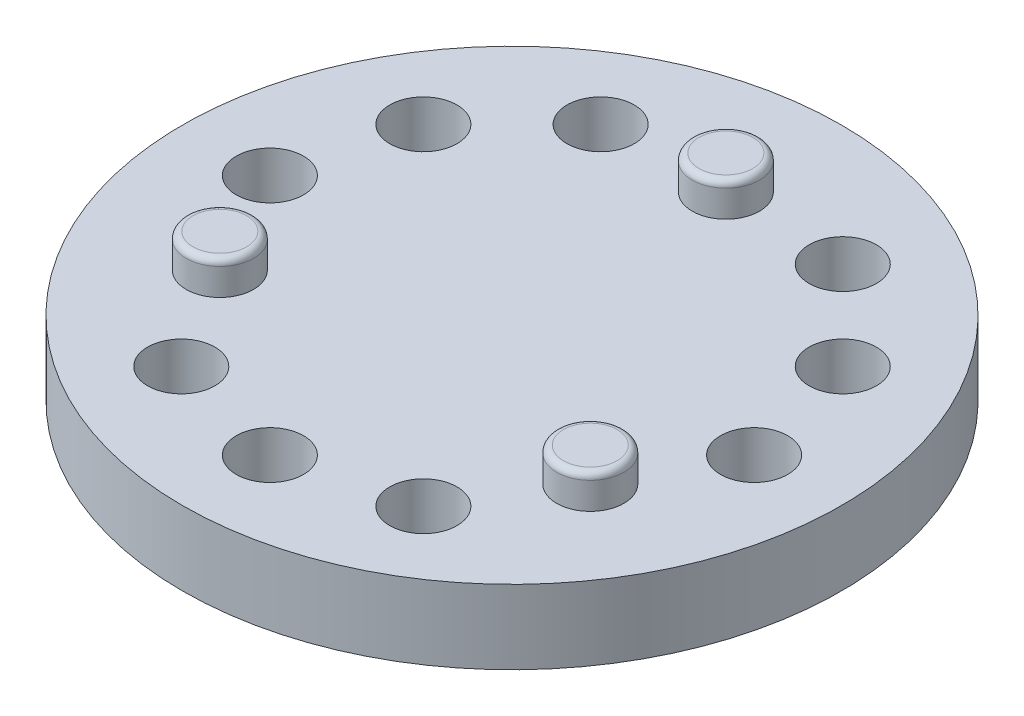
ISO-10303-21;
HEADER;
FILE_DESCRIPTION(('STEP AP214'),'2;1');
FILE_NAME('part.step','',(''),(''),'','','');
FILE_SCHEMA(('AUTOMOTIVE_DESIGN { 1 0 10303 214 1 1 1 1 }'));
ENDSEC;
DATA;
#1=APPLICATION_CONTEXT('core data for automotive mechanical design processes');
#2=APPLICATION_PROTOCOL_DEFINITION('international standard','automotive_design',2000,#1);
#3=PRODUCT_CONTEXT('',#1,'mechanical');
#4=PRODUCT('Part','Part','',(#3));
#5=PRODUCT_RELATED_PRODUCT_CATEGORY('part','',(#4));
#6=PRODUCT_DEFINITION_FORMATION('','',#4);
#7=PRODUCT_DEFINITION_CONTEXT('part definition',#1,'design');
#8=PRODUCT_DEFINITION('design','',#6,#7);
#9=PRODUCT_DEFINITION_SHAPE('','',#8);
#10=(LENGTH_UNIT() NAMED_UNIT(*) SI_UNIT(.MILLI.,.METRE.));
#11=(NAMED_UNIT(*) PLANE_ANGLE_UNIT() SI_UNIT($,.RADIAN.));
#12=(NAMED_UNIT(*) SI_UNIT($,.STERADIAN.) SOLID_ANGLE_UNIT());
#13=UNCERTAINTY_MEASURE_WITH_UNIT(LENGTH_MEASURE(1.E-05),#10,'distance_accuracy_value','');
#14=(GEOMETRIC_REPRESENTATION_CONTEXT(3) GLOBAL_UNCERTAINTY_ASSIGNED_CONTEXT((#13)) GLOBAL_UNIT_ASSIGNED_CONTEXT((#10,
#11,#12)) REPRESENTATION_CONTEXT('',''));
#15=CARTESIAN_POINT('',(0.,0.,0.));
#16=DIRECTION('',(0.,0.,1.));
#17=DIRECTION('',(1.,0.,0.));
#18=AXIS2_PLACEMENT_3D('',#15,#16,#17);
#19=CARTESIAN_POINT('',(0.,5.5,0.));
#20=DIRECTION('',(0.,-1.,0.));
#21=DIRECTION('',(0.,0.,-1.));
#22=AXIS2_PLACEMENT_3D('',#19,#20,#21);
#23=CYLINDRICAL_SURFACE('',#22,24.5);
#24=CARTESIAN_POINT('',(0.,5.5,0.));
#25=DIRECTION('',(0.,1.,0.));
#26=DIRECTION('',(0.,0.,1.));
#27=AXIS2_PLACEMENT_3D('',#24,#25,#26);
#28=CIRCLE('',#27,24.5);
#29=CARTESIAN_POINT('',(0.,5.5,24.5));
#30=VERTEX_POINT('',#29);
#31=EDGE_CURVE('E73',#30,#30,#28,.T.);
#32=ORIENTED_EDGE('',*,*,#31,.F.);
#33=EDGE_LOOP('',(#32));
#34=FACE_BOUND('',#33,.T.);
#35=CARTESIAN_POINT('',(0.,0.,0.));
#36=DIRECTION('',(0.,1.,0.));
#37=DIRECTION('',(0.,0.,1.));
#38=AXIS2_PLACEMENT_3D('',#35,#36,#37);
#39=CIRCLE('',#38,24.5);
#40=CARTESIAN_POINT('',(0.,0.,24.5));
#41=VERTEX_POINT('',#40);
#42=EDGE_CURVE('E78',#41,#41,#39,.T.);
#43=ORIENTED_EDGE('',*,*,#42,.T.);
#44=EDGE_LOOP('',(#43));
#45=FACE_BOUND('',#44,.T.);
#46=ADVANCED_FACE('F41',(#34,#45),#23,.T.);
#47=CARTESIAN_POINT('',(0.,5.5,0.));
#48=DIRECTION('',(0.,1.,0.));
#49=DIRECTION('',(0.,0.,1.));
#50=AXIS2_PLACEMENT_3D('',#47,#48,#49);
#51=PLANE('',#50);
#52=CARTESIAN_POINT('',(-13.7698039201709,5.5,7.94999999999895));
#53=DIRECTION('',(0.,1.,0.));
#54=DIRECTION('',(0.,0.,1.));
#55=AXIS2_PLACEMENT_3D('',#52,#53,#54);
#56=CIRCLE('',#55,2.50000000000063);
#57=CARTESIAN_POINT('',(-13.7698039201709,5.5,10.4499999999996));
#58=VERTEX_POINT('',#57);
#59=EDGE_CURVE('E161',#58,#58,#56,.T.);
#60=ORIENTED_EDGE('',*,*,#59,.F.);
#61=EDGE_LOOP('',(#60));
#62=FACE_BOUND('',#61,.T.);
#63=CARTESIAN_POINT('',(13.7698039201725,5.5,7.95000000000007));
#64=DIRECTION('',(0.,1.,0.));
#65=DIRECTION('',(0.,0.,1.));
#66=AXIS2_PLACEMENT_3D('',#63,#64,#65);
#67=CIRCLE('',#66,2.5);
#68=CARTESIAN_POINT('',(13.7698039201725,5.5,10.4500000000001));
#69=VERTEX_POINT('',#68);
#70=EDGE_CURVE('E157',#69,#69,#67,.T.);
#71=ORIENTED_EDGE('',*,*,#70,.F.);
#72=EDGE_LOOP('',(#71));
#73=FACE_BOUND('',#72,.T.);
#74=CARTESIAN_POINT('',(1.78074320378268E-12,5.5,-15.899999999999));
#75=DIRECTION('',(0.,1.,0.));
#76=DIRECTION('',(0.,0.,1.));
#77=AXIS2_PLACEMENT_3D('',#74,#75,#76);
#78=CIRCLE('',#77,2.49999999999858);
#79=CARTESIAN_POINT('',(1.78074320378268E-12,5.5,-13.4000000000004));
#80=VERTEX_POINT('',#79);
#81=EDGE_CURVE('E143',#80,#80,#78,.T.);
#82=ORIENTED_EDGE('',*,*,#81,.F.);
#83=EDGE_LOOP('',(#82));
#84=FACE_BOUND('',#83,.T.);
#85=CARTESIAN_POINT('',(-15.5884572681201,5.5,-8.99999999999809));
#86=DIRECTION('',(0.,1.,0.));
#87=DIRECTION('',(0.,0.,1.));
#88=AXIS2_PLACEMENT_3D('',#85,#86,#87);
#89=CIRCLE('',#88,2.50000000000189);
#90=CARTESIAN_POINT('',(-15.5884572681201,5.5,-6.4999999999962));
#91=VERTEX_POINT('',#90);
#92=EDGE_CURVE('E121',#91,#91,#89,.T.);
#93=ORIENTED_EDGE('',*,*,#92,.F.);
#94=EDGE_LOOP('',(#93));
#95=FACE_BOUND('',#94,.T.);
#96=CARTESIAN_POINT('',(-17.9999999999983,5.5,3.07118516144527E-12));
#97=DIRECTION('',(0.,1.,0.));
#98=DIRECTION('',(0.,0.,1.));
#99=AXIS2_PLACEMENT_3D('',#96,#97,#98);
#100=CIRCLE('',#99,2.50000000000349);
#101=CARTESIAN_POINT('',(-17.9999999999983,5.5,2.50000000000656));
#102=VERTEX_POINT('',#101);
#103=EDGE_CURVE('E131',#102,#102,#100,.T.);
#104=ORIENTED_EDGE('',*,*,#103,.F.);
#105=EDGE_LOOP('',(#104));
#106=FACE_BOUND('',#105,.T.);
#107=CARTESIAN_POINT('',(3.50527959155829E-12,5.5,18.0000000000023));
#108=DIRECTION('',(0.,1.,0.));
#109=DIRECTION('',(0.,0.,1.));
#110=AXIS2_PLACEMENT_3D('',#107,#108,#109);
#111=CIRCLE('',#110,2.50000000000076);
#112=CARTESIAN_POINT('',(3.50527959155829E-12,5.5,20.5000000000031));
#113=VERTEX_POINT('',#112);
#114=EDGE_CURVE('E126',#113,#113,#111,.T.);
#115=ORIENTED_EDGE('',*,*,#114,.F.);
#116=EDGE_LOOP('',(#115));
#117=FACE_BOUND('',#116,.T.);
#118=CARTESIAN_POINT('',(9.00000000000352,5.5,15.5884572681199));
#119=DIRECTION('',(0.,1.,0.));
#120=DIRECTION('',(0.,0.,1.));
#121=AXIS2_PLACEMENT_3D('',#118,#119,#120);
#122=CIRCLE('',#121,2.50000000000082);
#123=CARTESIAN_POINT('',(9.00000000000352,5.5,18.0884572681208));
#124=VERTEX_POINT('',#123);
#125=EDGE_CURVE('E122',#124,#124,#122,.T.);
#126=ORIENTED_EDGE('',*,*,#125,.F.);
#127=EDGE_LOOP('',(#126));
#128=FACE_BOUND('',#127,.T.);
#129=CARTESIAN_POINT('',(-9.00000000000117,5.5,-15.5884572681198));
#130=DIRECTION('',(0.,1.,0.));
#131=DIRECTION('',(0.,0.,1.));
#132=AXIS2_PLACEMENT_3D('',#129,#130,#131);
#133=CIRCLE('',#132,2.50000000000055);
#134=CARTESIAN_POINT('',(-9.00000000000117,5.5,-13.0884572681192));
#135=VERTEX_POINT('',#134);
#136=EDGE_CURVE('E127',#135,#135,#133,.T.);
#137=ORIENTED_EDGE('',*,*,#136,.F.);
#138=EDGE_LOOP('',(#137));
#139=FACE_BOUND('',#138,.T.);
#140=CARTESIAN_POINT('',(9.00000000000001,5.5,-15.5884572681199));
#141=DIRECTION('',(0.,1.,0.));
#142=DIRECTION('',(0.,0.,1.));
#143=AXIS2_PLACEMENT_3D('',#140,#141,#142);
#144=CIRCLE('',#143,2.5);
#145=CARTESIAN_POINT('',(9.00000000000001,5.5,-13.0884572681199));
#146=VERTEX_POINT('',#145);
#147=EDGE_CURVE('E147',#146,#146,#144,.T.);
#148=ORIENTED_EDGE('',*,*,#147,.F.);
#149=EDGE_LOOP('',(#148));
#150=FACE_BOUND('',#149,.T.);
#151=CARTESIAN_POINT('',(15.5884572681219,5.5,-9.00000000000112));
#152=DIRECTION('',(0.,1.,0.));
#153=DIRECTION('',(0.,0.,1.));
#154=AXIS2_PLACEMENT_3D('',#151,#152,#153);
#155=CIRCLE('',#154,2.49999999999832);
#156=CARTESIAN_POINT('',(15.5884572681219,5.5,-6.5000000000028));
#157=VERTEX_POINT('',#156);
#158=EDGE_CURVE('E142',#157,#157,#155,.T.);
#159=ORIENTED_EDGE('',*,*,#158,.F.);
#160=EDGE_LOOP('',(#159));
#161=FACE_BOUND('',#160,.T.);
#162=CARTESIAN_POINT('',(18.000000000004,5.5,-1.01915355016992E-12));
#163=DIRECTION('',(0.,1.,0.));
#164=DIRECTION('',(0.,0.,1.));
#165=AXIS2_PLACEMENT_3D('',#162,#163,#164);
#166=CIRCLE('',#165,2.49999999999782);
#167=CARTESIAN_POINT('',(18.000000000004,5.5,2.4999999999968));
#168=VERTEX_POINT('',#167);
#169=EDGE_CURVE('E138',#168,#168,#166,.T.);
#170=ORIENTED_EDGE('',*,*,#169,.F.);
#171=EDGE_LOOP('',(#170));
#172=FACE_BOUND('',#171,.T.);
#173=CARTESIAN_POINT('',(-8.99999999999758,5.5,15.5884572681239));
#174=DIRECTION('',(0.,1.,0.));
#175=DIRECTION('',(0.,0.,1.));
#176=AXIS2_PLACEMENT_3D('',#173,#174,#175);
#177=CIRCLE('',#176,2.50000000000125);
#178=CARTESIAN_POINT('',(-8.99999999999758,5.5,18.0884572681252));
#179=VERTEX_POINT('',#178);
#180=EDGE_CURVE('E111',#179,#179,#177,.T.);
#181=ORIENTED_EDGE('',*,*,#180,.F.);
#182=EDGE_LOOP('',(#181));
#183=FACE_BOUND('',#182,.T.);
#184=ORIENTED_EDGE('',*,*,#31,.T.);
#185=EDGE_LOOP('',(#184));
#186=FACE_BOUND('',#185,.T.);
#187=ADVANCED_FACE('F168',(#62,#73,#84,#95,#106,#117,#128,#139,#150,#161,#172,#183,#186),#51,.T.);
#188=CARTESIAN_POINT('',(0.,0.,0.));
#189=DIRECTION('',(0.,1.,0.));
#190=DIRECTION('',(0.,0.,1.));
#191=AXIS2_PLACEMENT_3D('',#188,#189,#190);
#192=PLANE('',#191);
#193=CARTESIAN_POINT('',(-15.5884572681201,0.,-8.99999999999809));
#194=DIRECTION('',(0.,1.,0.));
#195=DIRECTION('',(0.,0.,1.));
#196=AXIS2_PLACEMENT_3D('',#193,#194,#195);
#197=CIRCLE('',#196,2.50000000000189);
#198=CARTESIAN_POINT('',(-15.5884572681201,0.,-6.4999999999962));
#199=VERTEX_POINT('',#198);
#200=EDGE_CURVE('E74',#199,#199,#197,.T.);
#201=ORIENTED_EDGE('',*,*,#200,.T.);
#202=EDGE_LOOP('',(#201));
#203=FACE_BOUND('',#202,.T.);
#204=CARTESIAN_POINT('',(-17.9999999999983,0.,3.07118516144527E-12));
#205=DIRECTION('',(0.,1.,0.));
#206=DIRECTION('',(0.,0.,1.));
#207=AXIS2_PLACEMENT_3D('',#204,#205,#206);
#208=CIRCLE('',#207,2.50000000000349);
#209=CARTESIAN_POINT('',(-17.9999999999983,0.,2.50000000000656));
#210=VERTEX_POINT('',#209);
#211=EDGE_CURVE('E79',#210,#210,#208,.T.);
#212=ORIENTED_EDGE('',*,*,#211,.T.);
#213=EDGE_LOOP('',(#212));
#214=FACE_BOUND('',#213,.T.);
#215=CARTESIAN_POINT('',(3.50527959155829E-12,0.,18.0000000000023));
#216=DIRECTION('',(0.,1.,0.));
#217=DIRECTION('',(0.,0.,1.));
#218=AXIS2_PLACEMENT_3D('',#215,#216,#217);
#219=CIRCLE('',#218,2.50000000000076);
#220=CARTESIAN_POINT('',(3.50527959155829E-12,0.,20.5000000000031));
#221=VERTEX_POINT('',#220);
#222=EDGE_CURVE('E83',#221,#221,#219,.T.);
#223=ORIENTED_EDGE('',*,*,#222,.T.);
#224=EDGE_LOOP('',(#223));
#225=FACE_BOUND('',#224,.T.);
#226=CARTESIAN_POINT('',(9.00000000000352,0.,15.5884572681199));
#227=DIRECTION('',(0.,1.,0.));
#228=DIRECTION('',(0.,0.,1.));
#229=AXIS2_PLACEMENT_3D('',#226,#227,#228);
#230=CIRCLE('',#229,2.50000000000082);
#231=CARTESIAN_POINT('',(9.00000000000352,0.,18.0884572681208));
#232=VERTEX_POINT('',#231);
#233=EDGE_CURVE('E87',#232,#232,#230,.T.);
#234=ORIENTED_EDGE('',*,*,#233,.T.);
#235=EDGE_LOOP('',(#234));
#236=FACE_BOUND('',#235,.T.);
#237=CARTESIAN_POINT('',(-9.00000000000117,0.,-15.5884572681198));
#238=DIRECTION('',(0.,1.,0.));
#239=DIRECTION('',(0.,0.,1.));
#240=AXIS2_PLACEMENT_3D('',#237,#238,#239);
#241=CIRCLE('',#240,2.50000000000055);
#242=CARTESIAN_POINT('',(-9.00000000000117,0.,-13.0884572681192));
#243=VERTEX_POINT('',#242);
#244=EDGE_CURVE('E91',#243,#243,#241,.T.);
#245=ORIENTED_EDGE('',*,*,#244,.T.);
#246=EDGE_LOOP('',(#245));
#247=FACE_BOUND('',#246,.T.);
#248=CARTESIAN_POINT('',(9.00000000000001,0.,-15.5884572681199));
#249=DIRECTION('',(0.,1.,0.));
#250=DIRECTION('',(0.,0.,1.));
#251=AXIS2_PLACEMENT_3D('',#248,#249,#250);
#252=CIRCLE('',#251,2.5);
#253=CARTESIAN_POINT('',(9.00000000000001,0.,-13.0884572681199));
#254=VERTEX_POINT('',#253);
#255=EDGE_CURVE('E95',#254,#254,#252,.T.);
#256=ORIENTED_EDGE('',*,*,#255,.T.);
#257=EDGE_LOOP('',(#256));
#258=FACE_BOUND('',#257,.T.);
#259=CARTESIAN_POINT('',(15.5884572681219,0.,-9.00000000000112));
#260=DIRECTION('',(0.,1.,0.));
#261=DIRECTION('',(0.,0.,1.));
#262=AXIS2_PLACEMENT_3D('',#259,#260,#261);
#263=CIRCLE('',#262,2.49999999999832);
#264=CARTESIAN_POINT('',(15.5884572681219,0.,-6.5000000000028));
#265=VERTEX_POINT('',#264);
#266=EDGE_CURVE('E99',#265,#265,#263,.T.);
#267=ORIENTED_EDGE('',*,*,#266,.T.);
#268=EDGE_LOOP('',(#267));
#269=FACE_BOUND('',#268,.T.);
#270=CARTESIAN_POINT('',(18.000000000004,0.,-1.01915355016992E-12));
#271=DIRECTION('',(0.,1.,0.));
#272=DIRECTION('',(0.,0.,1.));
#273=AXIS2_PLACEMENT_3D('',#270,#271,#272);
#274=CIRCLE('',#273,2.49999999999782);
#275=CARTESIAN_POINT('',(18.000000000004,0.,2.4999999999968));
#276=VERTEX_POINT('',#275);
#277=EDGE_CURVE('E103',#276,#276,#274,.T.);
#278=ORIENTED_EDGE('',*,*,#277,.T.);
#279=EDGE_LOOP('',(#278));
#280=FACE_BOUND('',#279,.T.);
#281=CARTESIAN_POINT('',(-8.99999999999758,0.,15.5884572681239));
#282=DIRECTION('',(0.,1.,0.));
#283=DIRECTION('',(0.,0.,1.));
#284=AXIS2_PLACEMENT_3D('',#281,#282,#283);
#285=CIRCLE('',#284,2.50000000000125);
#286=CARTESIAN_POINT('',(-8.99999999999758,0.,18.0884572681252));
#287=VERTEX_POINT('',#286);
#288=EDGE_CURVE('E107',#287,#287,#285,.T.);
#289=ORIENTED_EDGE('',*,*,#288,.T.);
#290=EDGE_LOOP('',(#289));
#291=FACE_BOUND('',#290,.T.);
#292=ORIENTED_EDGE('',*,*,#42,.F.);
#293=EDGE_LOOP('',(#292));
#294=FACE_BOUND('',#293,.T.);
#295=ADVANCED_FACE('F171',(#203,#214,#225,#236,#247,#258,#269,#280,#291,#294),#192,.F.);
#296=CARTESIAN_POINT('',(-8.99999999999758,-1.1,15.5884572681239));
#297=DIRECTION('',(0.,1.,0.));
#298=DIRECTION('',(0.,0.,1.));
#299=AXIS2_PLACEMENT_3D('',#296,#297,#298);
#300=CYLINDRICAL_SURFACE('',#299,2.50000000000125);
#301=ORIENTED_EDGE('',*,*,#180,.T.);
#302=EDGE_LOOP('',(#301));
#303=FACE_BOUND('',#302,.T.);
#304=ORIENTED_EDGE('',*,*,#288,.F.);
#305=EDGE_LOOP('',(#304));
#306=FACE_BOUND('',#305,.T.);
#307=ADVANCED_FACE('F203',(#303,#306),#300,.F.);
#308=CARTESIAN_POINT('',(18.000000000004,-1.1,-1.01915355016992E-12));
#309=DIRECTION('',(0.,1.,0.));
#310=DIRECTION('',(0.,0.,1.));
#311=AXIS2_PLACEMENT_3D('',#308,#309,#310);
#312=CYLINDRICAL_SURFACE('',#311,2.49999999999782);
#313=ORIENTED_EDGE('',*,*,#169,.T.);
#314=EDGE_LOOP('',(#313));
#315=FACE_BOUND('',#314,.T.);
#316=ORIENTED_EDGE('',*,*,#277,.F.);
#317=EDGE_LOOP('',(#316));
#318=FACE_BOUND('',#317,.T.);
#319=ADVANCED_FACE('F209',(#315,#318),#312,.F.);
#320=CARTESIAN_POINT('',(15.5884572681219,-1.1,-9.00000000000112));
#321=DIRECTION('',(0.,1.,0.));
#322=DIRECTION('',(0.,0.,1.));
#323=AXIS2_PLACEMENT_3D('',#320,#321,#322);
#324=CYLINDRICAL_SURFACE('',#323,2.49999999999832);
#325=ORIENTED_EDGE('',*,*,#158,.T.);
#326=EDGE_LOOP('',(#325));
#327=FACE_BOUND('',#326,.T.);
#328=ORIENTED_EDGE('',*,*,#266,.F.);
#329=EDGE_LOOP('',(#328));
#330=FACE_BOUND('',#329,.T.);
#331=ADVANCED_FACE('F254',(#327,#330),#324,.F.);
#332=CARTESIAN_POINT('',(9.00000000000001,-1.1,-15.5884572681199));
#333=DIRECTION('',(0.,1.,0.));
#334=DIRECTION('',(0.,0.,1.));
#335=AXIS2_PLACEMENT_3D('',#332,#333,#334);
#336=CYLINDRICAL_SURFACE('',#335,2.5);
#337=ORIENTED_EDGE('',*,*,#147,.T.);
#338=EDGE_LOOP('',(#337));
#339=FACE_BOUND('',#338,.T.);
#340=ORIENTED_EDGE('',*,*,#255,.F.);
#341=EDGE_LOOP('',(#340));
#342=FACE_BOUND('',#341,.T.);
#343=ADVANCED_FACE('F250',(#339,#342),#336,.F.);
#344=CARTESIAN_POINT('',(-9.00000000000117,-1.1,-15.5884572681198));
#345=DIRECTION('',(0.,1.,0.));
#346=DIRECTION('',(0.,0.,1.));
#347=AXIS2_PLACEMENT_3D('',#344,#345,#346);
#348=CYLINDRICAL_SURFACE('',#347,2.50000000000055);
#349=ORIENTED_EDGE('',*,*,#136,.T.);
#350=EDGE_LOOP('',(#349));
#351=FACE_BOUND('',#350,.T.);
#352=ORIENTED_EDGE('',*,*,#244,.F.);
#353=EDGE_LOOP('',(#352));
#354=FACE_BOUND('',#353,.T.);
#355=ADVANCED_FACE('F246',(#351,#354),#348,.F.);
#356=CARTESIAN_POINT('',(9.00000000000352,-1.1,15.5884572681199));
#357=DIRECTION('',(0.,1.,0.));
#358=DIRECTION('',(0.,0.,1.));
#359=AXIS2_PLACEMENT_3D('',#356,#357,#358);
#360=CYLINDRICAL_SURFACE('',#359,2.50000000000082);
#361=ORIENTED_EDGE('',*,*,#125,.T.);
#362=EDGE_LOOP('',(#361));
#363=FACE_BOUND('',#362,.T.);
#364=ORIENTED_EDGE('',*,*,#233,.F.);
#365=EDGE_LOOP('',(#364));
#366=FACE_BOUND('',#365,.T.);
#367=ADVANCED_FACE('F249',(#363,#366),#360,.F.);
#368=CARTESIAN_POINT('',(3.50527959155829E-12,-1.1,18.0000000000023));
#369=DIRECTION('',(0.,1.,0.));
#370=DIRECTION('',(0.,0.,1.));
#371=AXIS2_PLACEMENT_3D('',#368,#369,#370);
#372=CYLINDRICAL_SURFACE('',#371,2.50000000000076);
#373=ORIENTED_EDGE('',*,*,#114,.T.);
#374=EDGE_LOOP('',(#373));
#375=FACE_BOUND('',#374,.T.);
#376=ORIENTED_EDGE('',*,*,#222,.F.);
#377=EDGE_LOOP('',(#376));
#378=FACE_BOUND('',#377,.T.);
#379=ADVANCED_FACE('F268',(#375,#378),#372,.F.);
#380=CARTESIAN_POINT('',(-17.9999999999983,-1.1,3.07118516144527E-12));
#381=DIRECTION('',(0.,1.,0.));
#382=DIRECTION('',(0.,0.,1.));
#383=AXIS2_PLACEMENT_3D('',#380,#381,#382);
#384=CYLINDRICAL_SURFACE('',#383,2.50000000000349);
#385=ORIENTED_EDGE('',*,*,#103,.T.);
#386=EDGE_LOOP('',(#385));
#387=FACE_BOUND('',#386,.T.);
#388=ORIENTED_EDGE('',*,*,#211,.F.);
#389=EDGE_LOOP('',(#388));
#390=FACE_BOUND('',#389,.T.);
#391=ADVANCED_FACE('F264',(#387,#390),#384,.F.);
#392=CARTESIAN_POINT('',(-15.5884572681201,-1.1,-8.99999999999809));
#393=DIRECTION('',(0.,1.,0.));
#394=DIRECTION('',(0.,0.,1.));
#395=AXIS2_PLACEMENT_3D('',#392,#393,#394);
#396=CYLINDRICAL_SURFACE('',#395,2.50000000000189);
#397=ORIENTED_EDGE('',*,*,#92,.T.);
#398=EDGE_LOOP('',(#397));
#399=FACE_BOUND('',#398,.T.);
#400=ORIENTED_EDGE('',*,*,#200,.F.);
#401=EDGE_LOOP('',(#400));
#402=FACE_BOUND('',#401,.T.);
#403=ADVANCED_FACE('F241',(#399,#402),#396,.F.);
#404=CARTESIAN_POINT('',(1.78074320378268E-12,8.,-15.899999999999));
#405=DIRECTION('',(0.,-1.,0.));
#406=DIRECTION('',(0.,0.,-1.));
#407=AXIS2_PLACEMENT_3D('',#404,#405,#406);
#408=CYLINDRICAL_SURFACE('',#407,2.49999999999858);
#409=CARTESIAN_POINT('',(1.78074320378268E-12,7.5,-15.899999999999));
#410=DIRECTION('',(0.,1.,0.));
#411=DIRECTION('',(0.,0.,1.));
#412=AXIS2_PLACEMENT_3D('',#409,#410,#411);
#413=CIRCLE('',#412,2.49999999999858);
#414=CARTESIAN_POINT('',(1.78074320378268E-12,7.5,-13.4000000000004));
#415=VERTEX_POINT('',#414);
#416=EDGE_CURVE('E54',#415,#415,#413,.F.);
#417=ORIENTED_EDGE('',*,*,#416,.T.);
#418=EDGE_LOOP('',(#417));
#419=FACE_BOUND('',#418,.T.);
#420=ORIENTED_EDGE('',*,*,#81,.T.);
#421=EDGE_LOOP('',(#420));
#422=FACE_BOUND('',#421,.T.);
#423=ADVANCED_FACE('F232',(#419,#422),#408,.T.);
#424=CARTESIAN_POINT('',(1.78074320378268E-12,8.,-15.899999999999));
#425=DIRECTION('',(0.,1.,0.));
#426=DIRECTION('',(0.,0.,1.));
#427=AXIS2_PLACEMENT_3D('',#424,#425,#426);
#428=PLANE('',#427);
#429=CARTESIAN_POINT('',(1.78074320378268E-12,8.,-15.899999999999));
#430=DIRECTION('',(0.,1.,0.));
#431=DIRECTION('',(0.,0.,1.));
#432=AXIS2_PLACEMENT_3D('',#429,#430,#431);
#433=CIRCLE('',#432,1.99999999999858);
#434=CARTESIAN_POINT('',(1.78074320378268E-12,8.,-13.9000000000004));
#435=VERTEX_POINT('',#434);
#436=EDGE_CURVE('E59',#435,#435,#433,.T.);
#437=ORIENTED_EDGE('',*,*,#436,.T.);
#438=EDGE_LOOP('',(#437));
#439=FACE_BOUND('',#438,.T.);
#440=ADVANCED_FACE('F229',(#439),#428,.T.);
#441=CARTESIAN_POINT('',(13.7698039201725,8.,7.95000000000007));
#442=DIRECTION('',(0.,-1.,0.));
#443=DIRECTION('',(0.,0.,-1.));
#444=AXIS2_PLACEMENT_3D('',#441,#442,#443);
#445=CYLINDRICAL_SURFACE('',#444,2.5);
#446=CARTESIAN_POINT('',(13.7698039201725,7.5,7.95000000000007));
#447=DIRECTION('',(0.,1.,0.));
#448=DIRECTION('',(0.,0.,1.));
#449=AXIS2_PLACEMENT_3D('',#446,#447,#448);
#450=CIRCLE('',#449,2.5);
#451=CARTESIAN_POINT('',(13.7698039201725,7.5,10.4500000000001));
#452=VERTEX_POINT('',#451);
#453=EDGE_CURVE('E65',#452,#452,#450,.F.);
#454=ORIENTED_EDGE('',*,*,#453,.T.);
#455=EDGE_LOOP('',(#454));
#456=FACE_BOUND('',#455,.T.);
#457=ORIENTED_EDGE('',*,*,#70,.T.);
#458=EDGE_LOOP('',(#457));
#459=FACE_BOUND('',#458,.T.);
#460=ADVANCED_FACE('F231',(#456,#459),#445,.T.);
#461=CARTESIAN_POINT('',(13.7698039201725,8.,7.95000000000007));
#462=DIRECTION('',(0.,1.,0.));
#463=DIRECTION('',(0.,0.,1.));
#464=AXIS2_PLACEMENT_3D('',#461,#462,#463);
#465=PLANE('',#464);
#466=CARTESIAN_POINT('',(13.7698039201725,8.,7.95000000000007));
#467=DIRECTION('',(0.,1.,0.));
#468=DIRECTION('',(0.,0.,1.));
#469=AXIS2_PLACEMENT_3D('',#466,#467,#468);
#470=CIRCLE('',#469,2.);
#471=CARTESIAN_POINT('',(13.7698039201725,8.,9.95000000000007));
#472=VERTEX_POINT('',#471);
#473=EDGE_CURVE('E69',#472,#472,#470,.T.);
#474=ORIENTED_EDGE('',*,*,#473,.T.);
#475=EDGE_LOOP('',(#474));
#476=FACE_BOUND('',#475,.T.);
#477=ADVANCED_FACE('F238',(#476),#465,.T.);
#478=CARTESIAN_POINT('',(-13.7698039201709,8.,7.94999999999895));
#479=DIRECTION('',(0.,-1.,0.));
#480=DIRECTION('',(0.,0.,-1.));
#481=AXIS2_PLACEMENT_3D('',#478,#479,#480);
#482=CYLINDRICAL_SURFACE('',#481,2.50000000000063);
#483=CARTESIAN_POINT('',(-13.7698039201709,7.5,7.94999999999895));
#484=DIRECTION('',(0.,1.,0.));
#485=DIRECTION('',(0.,0.,1.));
#486=AXIS2_PLACEMENT_3D('',#483,#484,#485);
#487=CIRCLE('',#486,2.50000000000063);
#488=CARTESIAN_POINT('',(-13.7698039201709,7.5,10.4499999999996));
#489=VERTEX_POINT('',#488);
#490=EDGE_CURVE('E10',#489,#489,#487,.F.);
#491=ORIENTED_EDGE('',*,*,#490,.T.);
#492=EDGE_LOOP('',(#491));
#493=FACE_BOUND('',#492,.T.);
#494=ORIENTED_EDGE('',*,*,#59,.T.);
#495=EDGE_LOOP('',(#494));
#496=FACE_BOUND('',#495,.T.);
#497=ADVANCED_FACE('F166',(#493,#496),#482,.T.);
#498=CARTESIAN_POINT('',(-13.7698039201709,8.,7.94999999999895));
#499=DIRECTION('',(0.,1.,0.));
#500=DIRECTION('',(0.,0.,1.));
#501=AXIS2_PLACEMENT_3D('',#498,#499,#500);
#502=PLANE('',#501);
#503=CARTESIAN_POINT('',(-13.7698039201709,8.,7.94999999999895));
#504=DIRECTION('',(0.,1.,0.));
#505=DIRECTION('',(0.,0.,1.));
#506=AXIS2_PLACEMENT_3D('',#503,#504,#505);
#507=CIRCLE('',#506,2.00000000000063);
#508=CARTESIAN_POINT('',(-13.7698039201709,8.,9.94999999999958));
#509=VERTEX_POINT('',#508);
#510=EDGE_CURVE('E49',#509,#509,#507,.T.);
#511=ORIENTED_EDGE('',*,*,#510,.T.);
#512=EDGE_LOOP('',(#511));
#513=FACE_BOUND('',#512,.T.);
#514=ADVANCED_FACE('F217',(#513),#502,.T.);
#515=CARTESIAN_POINT('',(13.7698039201725,7.5,7.95000000000007));
#516=DIRECTION('',(0.,1.,0.));
#517=DIRECTION('',(0.,0.,1.));
#518=AXIS2_PLACEMENT_3D('',#515,#516,#517);
#519=TOROIDAL_SURFACE('',#518,2.,0.5);
#520=ORIENTED_EDGE('',*,*,#453,.F.);
#521=EDGE_LOOP('',(#520));
#522=FACE_BOUND('',#521,.T.);
#523=ORIENTED_EDGE('',*,*,#473,.F.);
#524=EDGE_LOOP('',(#523));
#525=FACE_BOUND('',#524,.T.);
#526=ADVANCED_FACE('F214',(#522,#525),#519,.T.);
#527=CARTESIAN_POINT('',(1.78074320378268E-12,7.5,-15.899999999999));
#528=DIRECTION('',(0.,1.,0.));
#529=DIRECTION('',(0.,0.,1.));
#530=AXIS2_PLACEMENT_3D('',#527,#528,#529);
#531=TOROIDAL_SURFACE('',#530,1.99999999999858,0.5);
#532=ORIENTED_EDGE('',*,*,#416,.F.);
#533=EDGE_LOOP('',(#532));
#534=FACE_BOUND('',#533,.T.);
#535=ORIENTED_EDGE('',*,*,#436,.F.);
#536=EDGE_LOOP('',(#535));
#537=FACE_BOUND('',#536,.T.);
#538=ADVANCED_FACE('F216',(#534,#537),#531,.T.);
#539=CARTESIAN_POINT('',(-13.7698039201709,7.5,7.94999999999895));
#540=DIRECTION('',(0.,1.,0.));
#541=DIRECTION('',(0.,0.,1.));
#542=AXIS2_PLACEMENT_3D('',#539,#540,#541);
#543=TOROIDAL_SURFACE('',#542,2.00000000000063,0.5);
#544=ORIENTED_EDGE('',*,*,#490,.F.);
#545=EDGE_LOOP('',(#544));
#546=FACE_BOUND('',#545,.T.);
#547=ORIENTED_EDGE('',*,*,#510,.F.);
#548=EDGE_LOOP('',(#547));
#549=FACE_BOUND('',#548,.T.);
#550=ADVANCED_FACE('F43',(#546,#549),#543,.T.);
#551=CLOSED_SHELL('',(#46,#187,#295,#307,#319,#331,#343,#355,#367,#379,#391,#403,#423,#440,#460,
#477,#497,#514,#526,#538,#550));
#552=MANIFOLD_SOLID_BREP('B2',#551);
#553=ADVANCED_BREP_SHAPE_REPRESENTATION('',(#18,#552),#14);
#554=SHAPE_DEFINITION_REPRESENTATION(#9,#553);
ENDSEC;
END-ISO-10303-21;
